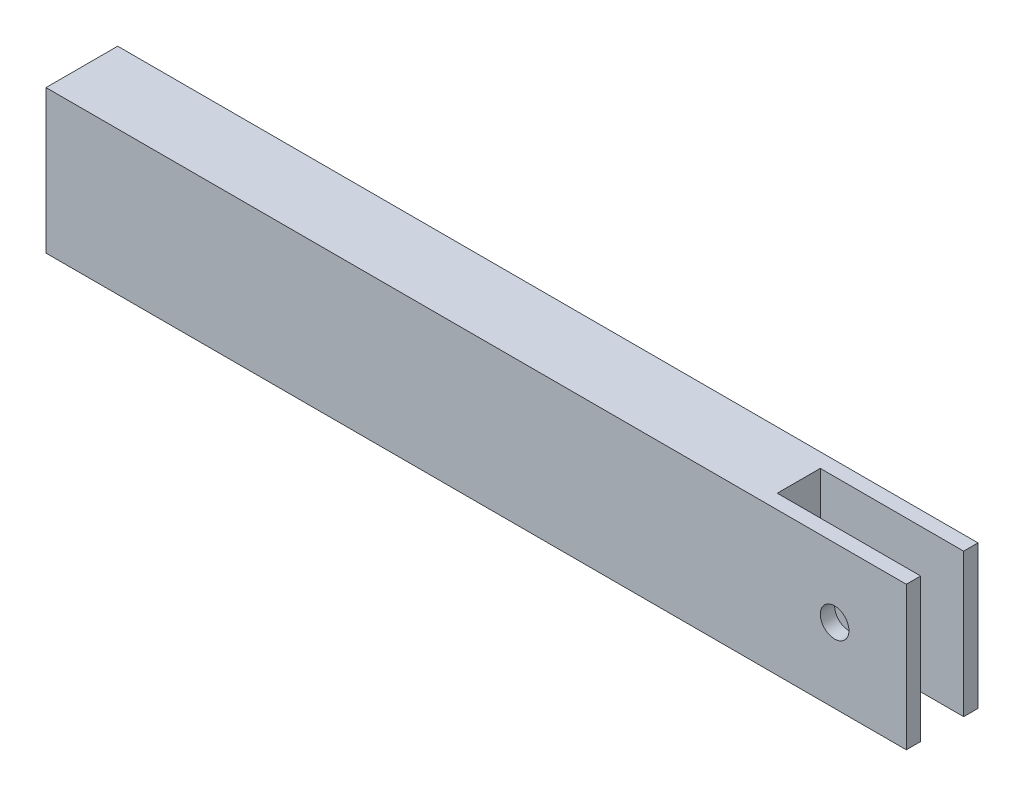
ISO-10303-21;
HEADER;
FILE_DESCRIPTION(('STEP AP214'),'2;1');
FILE_NAME('part.step','',(''),(''),'','','');
FILE_SCHEMA(('AUTOMOTIVE_DESIGN { 1 0 10303 214 1 1 1 1 }'));
ENDSEC;
DATA;
#1=APPLICATION_CONTEXT('core data for automotive mechanical design processes');
#2=APPLICATION_PROTOCOL_DEFINITION('international standard','automotive_design',2000,#1);
#3=PRODUCT_CONTEXT('',#1,'mechanical');
#4=PRODUCT('Part','Part','',(#3));
#5=PRODUCT_RELATED_PRODUCT_CATEGORY('part','',(#4));
#6=PRODUCT_DEFINITION_FORMATION('','',#4);
#7=PRODUCT_DEFINITION_CONTEXT('part definition',#1,'design');
#8=PRODUCT_DEFINITION('design','',#6,#7);
#9=PRODUCT_DEFINITION_SHAPE('','',#8);
#10=(LENGTH_UNIT() NAMED_UNIT(*) SI_UNIT(.MILLI.,.METRE.));
#11=(NAMED_UNIT(*) PLANE_ANGLE_UNIT() SI_UNIT($,.RADIAN.));
#12=(NAMED_UNIT(*) SI_UNIT($,.STERADIAN.) SOLID_ANGLE_UNIT());
#13=UNCERTAINTY_MEASURE_WITH_UNIT(LENGTH_MEASURE(1.E-05),#10,'distance_accuracy_value','');
#14=(GEOMETRIC_REPRESENTATION_CONTEXT(3) GLOBAL_UNCERTAINTY_ASSIGNED_CONTEXT((#13)) GLOBAL_UNIT_ASSIGNED_CONTEXT((#10,
#11,#12)) REPRESENTATION_CONTEXT('',''));
#15=CARTESIAN_POINT('',(0.,0.,0.));
#16=DIRECTION('',(0.,0.,1.));
#17=DIRECTION('',(1.,0.,0.));
#18=AXIS2_PLACEMENT_3D('',#15,#16,#17);
#19=CARTESIAN_POINT('',(600.,0.,50.));
#20=DIRECTION('',(-1.,0.,0.));
#21=DIRECTION('',(0.,-1.,0.));
#22=AXIS2_PLACEMENT_3D('',#19,#20,#21);
#23=PLANE('',#22);
#24=DIRECTION('',(0.,0.,-1.));
#25=VECTOR('',#24,1.);
#26=CARTESIAN_POINT('',(600.,0.,50.));
#27=LINE('',#26,#25);
#28=CARTESIAN_POINT('',(600.,0.,50.));
#29=VERTEX_POINT('',#28);
#30=CARTESIAN_POINT('',(600.,6.66133814775094E-13,40.));
#31=VERTEX_POINT('',#30);
#32=EDGE_CURVE('E45',#29,#31,#27,.T.);
#33=ORIENTED_EDGE('',*,*,#32,.T.);
#34=DIRECTION('',(0.,-1.,0.));
#35=VECTOR('',#34,1.);
#36=CARTESIAN_POINT('',(600.,100.,40.));
#37=LINE('',#36,#35);
#38=CARTESIAN_POINT('',(600.,100.,40.));
#39=VERTEX_POINT('',#38);
#40=EDGE_CURVE('E115',#39,#31,#37,.T.);
#41=ORIENTED_EDGE('',*,*,#40,.F.);
#42=DIRECTION('',(0.,0.,-1.));
#43=VECTOR('',#42,1.);
#44=CARTESIAN_POINT('',(600.,100.,50.));
#45=LINE('',#44,#43);
#46=CARTESIAN_POINT('',(600.,100.,50.));
#47=VERTEX_POINT('',#46);
#48=EDGE_CURVE('E163',#47,#39,#45,.T.);
#49=ORIENTED_EDGE('',*,*,#48,.F.);
#50=DIRECTION('',(0.,1.,0.));
#51=VECTOR('',#50,1.);
#52=CARTESIAN_POINT('',(600.,0.,50.));
#53=LINE('',#52,#51);
#54=EDGE_CURVE('E148',#29,#47,#53,.T.);
#55=ORIENTED_EDGE('',*,*,#54,.F.);
#56=EDGE_LOOP('',(#33,#41,#49,#55));
#57=FACE_BOUND('',#56,.T.);
#58=ADVANCED_FACE('F36',(#57),#23,.F.);
#59=CARTESIAN_POINT('',(0.,0.,50.));
#60=DIRECTION('',(1.,0.,0.));
#61=DIRECTION('',(0.,0.,-1.));
#62=AXIS2_PLACEMENT_3D('',#59,#60,#61);
#63=PLANE('',#62);
#64=DIRECTION('',(0.,-1.,0.));
#65=VECTOR('',#64,1.);
#66=CARTESIAN_POINT('',(0.,0.,0.));
#67=LINE('',#66,#65);
#68=CARTESIAN_POINT('',(0.,100.,0.));
#69=VERTEX_POINT('',#68);
#70=CARTESIAN_POINT('',(0.,0.,0.));
#71=VERTEX_POINT('',#70);
#72=EDGE_CURVE('E140',#69,#71,#67,.T.);
#73=ORIENTED_EDGE('',*,*,#72,.T.);
#74=DIRECTION('',(0.,0.,-1.));
#75=VECTOR('',#74,1.);
#76=CARTESIAN_POINT('',(0.,0.,50.));
#77=LINE('',#76,#75);
#78=CARTESIAN_POINT('',(0.,0.,50.));
#79=VERTEX_POINT('',#78);
#80=EDGE_CURVE('E11',#79,#71,#77,.T.);
#81=ORIENTED_EDGE('',*,*,#80,.F.);
#82=DIRECTION('',(0.,-1.,0.));
#83=VECTOR('',#82,1.);
#84=CARTESIAN_POINT('',(0.,0.,50.));
#85=LINE('',#84,#83);
#86=CARTESIAN_POINT('',(0.,100.,50.));
#87=VERTEX_POINT('',#86);
#88=EDGE_CURVE('E145',#87,#79,#85,.T.);
#89=ORIENTED_EDGE('',*,*,#88,.F.);
#90=DIRECTION('',(0.,0.,-1.));
#91=VECTOR('',#90,1.);
#92=CARTESIAN_POINT('',(0.,100.,50.));
#93=LINE('',#92,#91);
#94=EDGE_CURVE('E151',#87,#69,#93,.T.);
#95=ORIENTED_EDGE('',*,*,#94,.T.);
#96=EDGE_LOOP('',(#73,#81,#89,#95));
#97=FACE_BOUND('',#96,.T.);
#98=ADVANCED_FACE('F38',(#97),#63,.F.);
#99=CARTESIAN_POINT('',(0.,0.,50.));
#100=DIRECTION('',(0.,1.,0.));
#101=DIRECTION('',(0.,0.,1.));
#102=AXIS2_PLACEMENT_3D('',#99,#100,#101);
#103=PLANE('',#102);
#104=DIRECTION('',(0.,0.,-1.));
#105=VECTOR('',#104,1.);
#106=CARTESIAN_POINT('',(500.,5.55111512312578E-13,40.));
#107=LINE('',#106,#105);
#108=CARTESIAN_POINT('',(500.,5.55111512312578E-13,40.));
#109=VERTEX_POINT('',#108);
#110=CARTESIAN_POINT('',(500.,5.55111512312578E-13,9.99999999999999));
#111=VERTEX_POINT('',#110);
#112=EDGE_CURVE('E122',#109,#111,#107,.T.);
#113=ORIENTED_EDGE('',*,*,#112,.F.);
#114=DIRECTION('',(1.,0.,0.));
#115=VECTOR('',#114,1.);
#116=CARTESIAN_POINT('',(500.,5.55111512312578E-13,40.));
#117=LINE('',#116,#115);
#118=EDGE_CURVE('E110',#109,#31,#117,.T.);
#119=ORIENTED_EDGE('',*,*,#118,.T.);
#120=ORIENTED_EDGE('',*,*,#32,.F.);
#121=DIRECTION('',(1.,0.,0.));
#122=VECTOR('',#121,1.);
#123=CARTESIAN_POINT('',(0.,0.,50.));
#124=LINE('',#123,#122);
#125=EDGE_CURVE('E88',#79,#29,#124,.T.);
#126=ORIENTED_EDGE('',*,*,#125,.F.);
#127=ORIENTED_EDGE('',*,*,#80,.T.);
#128=DIRECTION('',(1.,0.,0.));
#129=VECTOR('',#128,1.);
#130=CARTESIAN_POINT('',(0.,0.,0.));
#131=LINE('',#130,#129);
#132=CARTESIAN_POINT('',(600.,0.,0.));
#133=VERTEX_POINT('',#132);
#134=EDGE_CURVE('E154',#71,#133,#131,.T.);
#135=ORIENTED_EDGE('',*,*,#134,.T.);
#136=CARTESIAN_POINT('',(600.,6.66133814775094E-13,9.99999999999999));
#137=VERTEX_POINT('',#136);
#138=EDGE_CURVE('E166',#137,#133,#27,.T.);
#139=ORIENTED_EDGE('',*,*,#138,.F.);
#140=DIRECTION('',(1.,0.,0.));
#141=VECTOR('',#140,1.);
#142=CARTESIAN_POINT('',(500.,5.55111512312578E-13,9.99999999999999));
#143=LINE('',#142,#141);
#144=EDGE_CURVE('E118',#111,#137,#143,.T.);
#145=ORIENTED_EDGE('',*,*,#144,.F.);
#146=EDGE_LOOP('',(#113,#119,#120,#126,#127,#135,#139,#145));
#147=FACE_BOUND('',#146,.T.);
#148=ADVANCED_FACE('F128',(#147),#103,.F.);
#149=CARTESIAN_POINT('',(600.,100.,10.));
#150=VERTEX_POINT('',#149);
#151=CARTESIAN_POINT('',(600.,100.,0.));
#152=VERTEX_POINT('',#151);
#153=EDGE_CURVE('E162',#150,#152,#45,.T.);
#154=ORIENTED_EDGE('',*,*,#153,.F.);
#155=DIRECTION('',(0.,1.,0.));
#156=VECTOR('',#155,1.);
#157=CARTESIAN_POINT('',(600.,100.,10.));
#158=LINE('',#157,#156);
#159=EDGE_CURVE('E126',#137,#150,#158,.T.);
#160=ORIENTED_EDGE('',*,*,#159,.F.);
#161=ORIENTED_EDGE('',*,*,#138,.T.);
#162=DIRECTION('',(0.,1.,0.));
#163=VECTOR('',#162,1.);
#164=CARTESIAN_POINT('',(600.,0.,0.));
#165=LINE('',#164,#163);
#166=EDGE_CURVE('E157',#133,#152,#165,.T.);
#167=ORIENTED_EDGE('',*,*,#166,.T.);
#168=EDGE_LOOP('',(#154,#160,#161,#167));
#169=FACE_BOUND('',#168,.T.);
#170=ADVANCED_FACE('F172',(#169),#23,.F.);
#171=CARTESIAN_POINT('',(0.,100.,50.));
#172=DIRECTION('',(0.,-1.,0.));
#173=DIRECTION('',(0.,0.,-1.));
#174=AXIS2_PLACEMENT_3D('',#171,#172,#173);
#175=PLANE('',#174);
#176=ORIENTED_EDGE('',*,*,#48,.T.);
#177=DIRECTION('',(1.,0.,0.));
#178=VECTOR('',#177,1.);
#179=CARTESIAN_POINT('',(500.,99.9999999999999,40.));
#180=LINE('',#179,#178);
#181=CARTESIAN_POINT('',(500.,99.9999999999999,40.));
#182=VERTEX_POINT('',#181);
#183=EDGE_CURVE('E138',#182,#39,#180,.T.);
#184=ORIENTED_EDGE('',*,*,#183,.F.);
#185=DIRECTION('',(0.,0.,1.));
#186=VECTOR('',#185,1.);
#187=CARTESIAN_POINT('',(500.,99.9999999999999,40.));
#188=LINE('',#187,#186);
#189=CARTESIAN_POINT('',(500.,100.,9.99999999999999));
#190=VERTEX_POINT('',#189);
#191=EDGE_CURVE('E119',#190,#182,#188,.T.);
#192=ORIENTED_EDGE('',*,*,#191,.F.);
#193=DIRECTION('',(1.,0.,0.));
#194=VECTOR('',#193,1.);
#195=CARTESIAN_POINT('',(500.,99.9999999999999,10.));
#196=LINE('',#195,#194);
#197=EDGE_CURVE('E141',#190,#150,#196,.T.);
#198=ORIENTED_EDGE('',*,*,#197,.T.);
#199=ORIENTED_EDGE('',*,*,#153,.T.);
#200=DIRECTION('',(-1.,0.,0.));
#201=VECTOR('',#200,1.);
#202=CARTESIAN_POINT('',(0.,100.,0.));
#203=LINE('',#202,#201);
#204=EDGE_CURVE('E81',#152,#69,#203,.T.);
#205=ORIENTED_EDGE('',*,*,#204,.T.);
#206=ORIENTED_EDGE('',*,*,#94,.F.);
#207=DIRECTION('',(-1.,0.,0.));
#208=VECTOR('',#207,1.);
#209=CARTESIAN_POINT('',(0.,100.,50.));
#210=LINE('',#209,#208);
#211=EDGE_CURVE('E61',#47,#87,#210,.T.);
#212=ORIENTED_EDGE('',*,*,#211,.F.);
#213=EDGE_LOOP('',(#176,#184,#192,#198,#199,#205,#206,#212));
#214=FACE_BOUND('',#213,.T.);
#215=ADVANCED_FACE('F180',(#214),#175,.F.);
#216=CARTESIAN_POINT('',(0.,0.,50.));
#217=DIRECTION('',(0.,0.,-1.));
#218=DIRECTION('',(-1.,0.,0.));
#219=AXIS2_PLACEMENT_3D('',#216,#217,#218);
#220=PLANE('',#219);
#221=CARTESIAN_POINT('',(550.,51.9500232108523,50.));
#222=DIRECTION('',(0.,0.,1.));
#223=DIRECTION('',(1.,0.,0.));
#224=AXIS2_PLACEMENT_3D('',#221,#222,#223);
#225=CIRCLE('',#224,9.99999999999998);
#226=CARTESIAN_POINT('',(560.,51.9500232108523,50.));
#227=VERTEX_POINT('',#226);
#228=EDGE_CURVE('E311',#227,#227,#225,.T.);
#229=ORIENTED_EDGE('',*,*,#228,.F.);
#230=EDGE_LOOP('',(#229));
#231=FACE_BOUND('',#230,.T.);
#232=ORIENTED_EDGE('',*,*,#88,.T.);
#233=ORIENTED_EDGE('',*,*,#125,.T.);
#234=ORIENTED_EDGE('',*,*,#54,.T.);
#235=ORIENTED_EDGE('',*,*,#211,.T.);
#236=EDGE_LOOP('',(#232,#233,#234,#235));
#237=FACE_BOUND('',#236,.T.);
#238=ADVANCED_FACE('F182',(#231,#237),#220,.F.);
#239=CARTESIAN_POINT('',(0.,0.,0.));
#240=DIRECTION('',(0.,0.,-1.));
#241=DIRECTION('',(-1.,0.,0.));
#242=AXIS2_PLACEMENT_3D('',#239,#240,#241);
#243=PLANE('',#242);
#244=CARTESIAN_POINT('',(550.,51.9500232108523,0.));
#245=DIRECTION('',(0.,0.,1.));
#246=DIRECTION('',(1.,0.,0.));
#247=AXIS2_PLACEMENT_3D('',#244,#245,#246);
#248=CIRCLE('',#247,9.99999999999998);
#249=CARTESIAN_POINT('',(560.,51.9500232108523,0.));
#250=VERTEX_POINT('',#249);
#251=EDGE_CURVE('E315',#250,#250,#248,.T.);
#252=ORIENTED_EDGE('',*,*,#251,.T.);
#253=EDGE_LOOP('',(#252));
#254=FACE_BOUND('',#253,.T.);
#255=ORIENTED_EDGE('',*,*,#72,.F.);
#256=ORIENTED_EDGE('',*,*,#204,.F.);
#257=ORIENTED_EDGE('',*,*,#166,.F.);
#258=ORIENTED_EDGE('',*,*,#134,.F.);
#259=EDGE_LOOP('',(#255,#256,#257,#258));
#260=FACE_BOUND('',#259,.T.);
#261=ADVANCED_FACE('F177',(#254,#260),#243,.T.);
#262=CARTESIAN_POINT('',(500.,99.9999999999999,40.));
#263=DIRECTION('',(0.,0.,1.));
#264=DIRECTION('',(0.,-1.,0.));
#265=AXIS2_PLACEMENT_3D('',#262,#263,#264);
#266=PLANE('',#265);
#267=CARTESIAN_POINT('',(550.,51.9500232108523,40.));
#268=DIRECTION('',(0.,0.,1.));
#269=DIRECTION('',(0.,-1.,0.));
#270=AXIS2_PLACEMENT_3D('',#267,#268,#269);
#271=CIRCLE('',#270,9.99999999999998);
#272=CARTESIAN_POINT('',(560.,51.9500232108523,40.));
#273=VERTEX_POINT('',#272);
#274=EDGE_CURVE('E136',#273,#273,#271,.T.);
#275=ORIENTED_EDGE('',*,*,#274,.T.);
#276=EDGE_LOOP('',(#275));
#277=FACE_BOUND('',#276,.T.);
#278=ORIENTED_EDGE('',*,*,#40,.T.);
#279=ORIENTED_EDGE('',*,*,#118,.F.);
#280=DIRECTION('',(0.,-1.,0.));
#281=VECTOR('',#280,1.);
#282=CARTESIAN_POINT('',(500.,99.9999999999999,40.));
#283=LINE('',#282,#281);
#284=EDGE_CURVE('E113',#182,#109,#283,.T.);
#285=ORIENTED_EDGE('',*,*,#284,.F.);
#286=ORIENTED_EDGE('',*,*,#183,.T.);
#287=EDGE_LOOP('',(#278,#279,#285,#286));
#288=FACE_BOUND('',#287,.T.);
#289=ADVANCED_FACE('F112',(#277,#288),#266,.F.);
#290=CARTESIAN_POINT('',(500.,99.9999999999999,10.));
#291=DIRECTION('',(0.,0.,-1.));
#292=DIRECTION('',(0.,1.,0.));
#293=AXIS2_PLACEMENT_3D('',#290,#291,#292);
#294=PLANE('',#293);
#295=CARTESIAN_POINT('',(550.,51.9500232108523,9.99999999999999));
#296=DIRECTION('',(0.,0.,-1.));
#297=DIRECTION('',(0.,1.,0.));
#298=AXIS2_PLACEMENT_3D('',#295,#296,#297);
#299=CIRCLE('',#298,9.99999999999998);
#300=CARTESIAN_POINT('',(560.,51.9500232108523,9.99999999999999));
#301=VERTEX_POINT('',#300);
#302=EDGE_CURVE('E40',#301,#301,#299,.T.);
#303=ORIENTED_EDGE('',*,*,#302,.T.);
#304=EDGE_LOOP('',(#303));
#305=FACE_BOUND('',#304,.T.);
#306=ORIENTED_EDGE('',*,*,#159,.T.);
#307=ORIENTED_EDGE('',*,*,#197,.F.);
#308=DIRECTION('',(0.,1.,0.));
#309=VECTOR('',#308,1.);
#310=CARTESIAN_POINT('',(500.,99.9999999999999,10.));
#311=LINE('',#310,#309);
#312=EDGE_CURVE('E52',#111,#190,#311,.T.);
#313=ORIENTED_EDGE('',*,*,#312,.F.);
#314=ORIENTED_EDGE('',*,*,#144,.T.);
#315=EDGE_LOOP('',(#306,#307,#313,#314));
#316=FACE_BOUND('',#315,.T.);
#317=ADVANCED_FACE('F230',(#305,#316),#294,.F.);
#318=CARTESIAN_POINT('',(500.,5.55111512312583E-13,0.));
#319=DIRECTION('',(1.,0.,0.));
#320=DIRECTION('',(0.,1.,0.));
#321=AXIS2_PLACEMENT_3D('',#318,#319,#320);
#322=PLANE('',#321);
#323=ORIENTED_EDGE('',*,*,#284,.T.);
#324=ORIENTED_EDGE('',*,*,#112,.T.);
#325=ORIENTED_EDGE('',*,*,#312,.T.);
#326=ORIENTED_EDGE('',*,*,#191,.T.);
#327=EDGE_LOOP('',(#323,#324,#325,#326));
#328=FACE_BOUND('',#327,.T.);
#329=ADVANCED_FACE('F121',(#328),#322,.T.);
#330=CARTESIAN_POINT('',(550.,51.9500232108523,0.));
#331=DIRECTION('',(0.,0.,1.));
#332=DIRECTION('',(1.,0.,0.));
#333=AXIS2_PLACEMENT_3D('',#330,#331,#332);
#334=CYLINDRICAL_SURFACE('',#333,9.99999999999998);
#335=CARTESIAN_POINT('',(560.,51.9500232108523,0.));
#336=CARTESIAN_POINT('',(560.,51.9500232108523,0.104166666666667));
#337=CARTESIAN_POINT('',(560.,51.9500232108523,0.208333333333333));
#338=CARTESIAN_POINT('',(560.,51.9500232108523,0.416666666666666));
#339=CARTESIAN_POINT('',(560.,51.9500232108523,0.520833333333333));
#340=CARTESIAN_POINT('',(560.,51.9500232108523,0.729166666666666));
#341=CARTESIAN_POINT('',(560.,51.9500232108523,0.833333333333333));
#342=CARTESIAN_POINT('',(560.,51.9500232108523,1.04166666666667));
#343=CARTESIAN_POINT('',(560.,51.9500232108523,1.14583333333333));
#344=CARTESIAN_POINT('',(560.,51.9500232108523,1.35416666666667));
#345=CARTESIAN_POINT('',(560.,51.9500232108523,1.45833333333333));
#346=CARTESIAN_POINT('',(560.,51.9500232108523,1.66666666666667));
#347=CARTESIAN_POINT('',(560.,51.9500232108523,1.77083333333333));
#348=CARTESIAN_POINT('',(560.,51.9500232108523,1.97916666666667));
#349=CARTESIAN_POINT('',(560.,51.9500232108523,2.08333333333333));
#350=CARTESIAN_POINT('',(560.,51.9500232108523,2.29166666666666));
#351=CARTESIAN_POINT('',(560.,51.9500232108523,2.39583333333333));
#352=CARTESIAN_POINT('',(560.,51.9500232108523,2.60416666666666));
#353=CARTESIAN_POINT('',(560.,51.9500232108523,2.70833333333333));
#354=CARTESIAN_POINT('',(560.,51.9500232108523,2.91666666666666));
#355=CARTESIAN_POINT('',(560.,51.9500232108523,3.02083333333333));
#356=CARTESIAN_POINT('',(560.,51.9500232108523,3.22916666666666));
#357=CARTESIAN_POINT('',(560.,51.9500232108523,3.33333333333333));
#358=CARTESIAN_POINT('',(560.,51.9500232108523,3.54166666666666));
#359=CARTESIAN_POINT('',(560.,51.9500232108523,3.64583333333333));
#360=CARTESIAN_POINT('',(560.,51.9500232108523,3.85416666666666));
#361=CARTESIAN_POINT('',(560.,51.9500232108523,3.95833333333333));
#362=CARTESIAN_POINT('',(560.,51.9500232108523,4.16666666666666));
#363=CARTESIAN_POINT('',(560.,51.9500232108523,4.27083333333333));
#364=CARTESIAN_POINT('',(560.,51.9500232108523,4.47916666666666));
#365=CARTESIAN_POINT('',(560.,51.9500232108523,4.58333333333333));
#366=CARTESIAN_POINT('',(560.,51.9500232108523,4.79166666666666));
#367=CARTESIAN_POINT('',(560.,51.9500232108523,4.89583333333333));
#368=CARTESIAN_POINT('',(560.,51.9500232108523,5.10416666666666));
#369=CARTESIAN_POINT('',(560.,51.9500232108523,5.20833333333333));
#370=CARTESIAN_POINT('',(560.,51.9500232108523,5.41666666666666));
#371=CARTESIAN_POINT('',(560.,51.9500232108523,5.52083333333333));
#372=CARTESIAN_POINT('',(560.,51.9500232108523,5.72916666666666));
#373=CARTESIAN_POINT('',(560.,51.9500232108523,5.83333333333333));
#374=CARTESIAN_POINT('',(560.,51.9500232108523,6.04166666666666));
#375=CARTESIAN_POINT('',(560.,51.9500232108523,6.14583333333333));
#376=CARTESIAN_POINT('',(560.,51.9500232108523,6.35416666666666));
#377=CARTESIAN_POINT('',(560.,51.9500232108523,6.45833333333333));
#378=CARTESIAN_POINT('',(560.,51.9500232108523,6.66666666666666));
#379=CARTESIAN_POINT('',(560.,51.9500232108523,6.77083333333333));
#380=CARTESIAN_POINT('',(560.,51.9500232108523,6.97916666666666));
#381=CARTESIAN_POINT('',(560.,51.9500232108523,7.08333333333333));
#382=CARTESIAN_POINT('',(560.,51.9500232108523,7.29166666666666));
#383=CARTESIAN_POINT('',(560.,51.9500232108523,7.39583333333333));
#384=CARTESIAN_POINT('',(560.,51.9500232108523,7.60416666666666));
#385=CARTESIAN_POINT('',(560.,51.9500232108523,7.70833333333333));
#386=CARTESIAN_POINT('',(560.,51.9500232108523,7.91666666666666));
#387=CARTESIAN_POINT('',(560.,51.9500232108523,8.02083333333333));
#388=CARTESIAN_POINT('',(560.,51.9500232108523,8.22916666666666));
#389=CARTESIAN_POINT('',(560.,51.9500232108523,8.33333333333333));
#390=CARTESIAN_POINT('',(560.,51.9500232108523,8.54166666666666));
#391=CARTESIAN_POINT('',(560.,51.9500232108523,8.64583333333333));
#392=CARTESIAN_POINT('',(560.,51.9500232108523,8.85416666666666));
#393=CARTESIAN_POINT('',(560.,51.9500232108523,8.95833333333333));
#394=CARTESIAN_POINT('',(560.,51.9500232108523,9.16666666666666));
#395=CARTESIAN_POINT('',(560.,51.9500232108523,9.27083333333333));
#396=CARTESIAN_POINT('',(560.,51.9500232108523,9.47916666666666));
#397=CARTESIAN_POINT('',(560.,51.9500232108523,9.58333333333333));
#398=CARTESIAN_POINT('',(560.,51.9500232108523,9.79166666666666));
#399=CARTESIAN_POINT('',(560.,51.9500232108523,9.89583333333333));
#400=CARTESIAN_POINT('',(560.,51.9500232108523,9.99999999999999));
#401=B_SPLINE_CURVE_WITH_KNOTS('',3,(#335,#336,#337,#338,#339,#340,#341,#342,#343,#344,#345,
#346,#347,#348,#349,#350,#351,#352,#353,#354,#355,#356,#357,#358,#359,#360,#361,#362,#363,#364,
#365,#366,#367,#368,#369,#370,#371,#372,#373,#374,#375,#376,#377,#378,#379,#380,#381,#382,#383,
#384,#385,#386,#387,#388,#389,#390,#391,#392,#393,#394,#395,#396,#397,#398,#399,#400),
.UNSPECIFIED.,.F.,.F.,(4,2,2,2,2,2,2,2,2,2,2,2,2,2,2,2,2,2,2,2,2,2,2,2,2,2,2,2,2,2,2,2,4),(0.,
0.3125,0.625,0.937499999999999,1.25,1.5625,1.875,2.1875,2.5,2.8125,3.125,3.4375,3.75,4.0625,
4.375,4.6875,5.,5.3125,5.625,5.9375,6.25,6.5625,6.875,7.18749999999999,7.5,7.8125,
8.12499999999999,8.43749999999999,8.74999999999999,9.06249999999999,9.37499999999999,
9.68749999999999,9.99999999999999),.UNSPECIFIED.);
#402=EDGE_CURVE('BSEAM248',#250,#301,#401,.T.);
#403=ORIENTED_EDGE('',*,*,#251,.F.);
#404=ORIENTED_EDGE('',*,*,#302,.F.);
#405=ORIENTED_EDGE('',*,*,#402,.T.);
#406=ORIENTED_EDGE('',*,*,#402,.F.);
#407=EDGE_LOOP('',(#403,#405,#404,#406));
#408=FACE_BOUND('',#407,.T.);
#409=ADVANCED_FACE('F248',(#408),#334,.F.);
#410=CARTESIAN_POINT('',(560.,51.9500232108523,50.));
#411=CARTESIAN_POINT('',(560.,51.9500232108523,49.8958333333333));
#412=CARTESIAN_POINT('',(560.,51.9500232108523,49.7916666666667));
#413=CARTESIAN_POINT('',(560.,51.9500232108523,49.5833333333333));
#414=CARTESIAN_POINT('',(560.,51.9500232108523,49.4791666666667));
#415=CARTESIAN_POINT('',(560.,51.9500232108523,49.2708333333333));
#416=CARTESIAN_POINT('',(560.,51.9500232108523,49.1666666666667));
#417=CARTESIAN_POINT('',(560.,51.9500232108523,48.9583333333333));
#418=CARTESIAN_POINT('',(560.,51.9500232108523,48.8541666666667));
#419=CARTESIAN_POINT('',(560.,51.9500232108523,48.6458333333333));
#420=CARTESIAN_POINT('',(560.,51.9500232108523,48.5416666666667));
#421=CARTESIAN_POINT('',(560.,51.9500232108523,48.3333333333333));
#422=CARTESIAN_POINT('',(560.,51.9500232108523,48.2291666666667));
#423=CARTESIAN_POINT('',(560.,51.9500232108523,48.0208333333333));
#424=CARTESIAN_POINT('',(560.,51.9500232108523,47.9166666666667));
#425=CARTESIAN_POINT('',(560.,51.9500232108523,47.7083333333333));
#426=CARTESIAN_POINT('',(560.,51.9500232108523,47.6041666666667));
#427=CARTESIAN_POINT('',(560.,51.9500232108523,47.3958333333333));
#428=CARTESIAN_POINT('',(560.,51.9500232108523,47.2916666666667));
#429=CARTESIAN_POINT('',(560.,51.9500232108523,47.0833333333333));
#430=CARTESIAN_POINT('',(560.,51.9500232108523,46.9791666666667));
#431=CARTESIAN_POINT('',(560.,51.9500232108523,46.7708333333333));
#432=CARTESIAN_POINT('',(560.,51.9500232108523,46.6666666666667));
#433=CARTESIAN_POINT('',(560.,51.9500232108523,46.4583333333333));
#434=CARTESIAN_POINT('',(560.,51.9500232108523,46.3541666666667));
#435=CARTESIAN_POINT('',(560.,51.9500232108523,46.1458333333333));
#436=CARTESIAN_POINT('',(560.,51.9500232108523,46.0416666666667));
#437=CARTESIAN_POINT('',(560.,51.9500232108523,45.8333333333333));
#438=CARTESIAN_POINT('',(560.,51.9500232108523,45.7291666666667));
#439=CARTESIAN_POINT('',(560.,51.9500232108523,45.5208333333333));
#440=CARTESIAN_POINT('',(560.,51.9500232108523,45.4166666666667));
#441=CARTESIAN_POINT('',(560.,51.9500232108523,45.2083333333333));
#442=CARTESIAN_POINT('',(560.,51.9500232108523,45.1041666666667));
#443=CARTESIAN_POINT('',(560.,51.9500232108523,44.8958333333333));
#444=CARTESIAN_POINT('',(560.,51.9500232108523,44.7916666666667));
#445=CARTESIAN_POINT('',(560.,51.9500232108523,44.5833333333333));
#446=CARTESIAN_POINT('',(560.,51.9500232108523,44.4791666666667));
#447=CARTESIAN_POINT('',(560.,51.9500232108523,44.2708333333333));
#448=CARTESIAN_POINT('',(560.,51.9500232108523,44.1666666666667));
#449=CARTESIAN_POINT('',(560.,51.9500232108523,43.9583333333333));
#450=CARTESIAN_POINT('',(560.,51.9500232108523,43.8541666666667));
#451=CARTESIAN_POINT('',(560.,51.9500232108523,43.6458333333333));
#452=CARTESIAN_POINT('',(560.,51.9500232108523,43.5416666666667));
#453=CARTESIAN_POINT('',(560.,51.9500232108523,43.3333333333333));
#454=CARTESIAN_POINT('',(560.,51.9500232108523,43.2291666666667));
#455=CARTESIAN_POINT('',(560.,51.9500232108523,43.0208333333333));
#456=CARTESIAN_POINT('',(560.,51.9500232108523,42.9166666666667));
#457=CARTESIAN_POINT('',(560.,51.9500232108523,42.7083333333333));
#458=CARTESIAN_POINT('',(560.,51.9500232108523,42.6041666666667));
#459=CARTESIAN_POINT('',(560.,51.9500232108523,42.3958333333333));
#460=CARTESIAN_POINT('',(560.,51.9500232108523,42.2916666666667));
#461=CARTESIAN_POINT('',(560.,51.9500232108523,42.0833333333333));
#462=CARTESIAN_POINT('',(560.,51.9500232108523,41.9791666666667));
#463=CARTESIAN_POINT('',(560.,51.9500232108523,41.7708333333333));
#464=CARTESIAN_POINT('',(560.,51.9500232108523,41.6666666666667));
#465=CARTESIAN_POINT('',(560.,51.9500232108523,41.4583333333333));
#466=CARTESIAN_POINT('',(560.,51.9500232108523,41.3541666666667));
#467=CARTESIAN_POINT('',(560.,51.9500232108523,41.1458333333333));
#468=CARTESIAN_POINT('',(560.,51.9500232108523,41.0416666666667));
#469=CARTESIAN_POINT('',(560.,51.9500232108523,40.8333333333333));
#470=CARTESIAN_POINT('',(560.,51.9500232108523,40.7291666666667));
#471=CARTESIAN_POINT('',(560.,51.9500232108523,40.5208333333333));
#472=CARTESIAN_POINT('',(560.,51.9500232108523,40.4166666666667));
#473=CARTESIAN_POINT('',(560.,51.9500232108523,40.2083333333333));
#474=CARTESIAN_POINT('',(560.,51.9500232108523,40.1041666666667));
#475=CARTESIAN_POINT('',(560.,51.9500232108523,40.));
#476=B_SPLINE_CURVE_WITH_KNOTS('',3,(#410,#411,#412,#413,#414,#415,#416,#417,#418,#419,#420,
#421,#422,#423,#424,#425,#426,#427,#428,#429,#430,#431,#432,#433,#434,#435,#436,#437,#438,#439,
#440,#441,#442,#443,#444,#445,#446,#447,#448,#449,#450,#451,#452,#453,#454,#455,#456,#457,#458,
#459,#460,#461,#462,#463,#464,#465,#466,#467,#468,#469,#470,#471,#472,#473,#474,#475),
.UNSPECIFIED.,.F.,.F.,(4,2,2,2,2,2,2,2,2,2,2,2,2,2,2,2,2,2,2,2,2,2,2,2,2,2,2,2,2,2,2,2,4),(0.,
0.3125,0.625000000000001,0.937500000000001,1.25,1.5625,1.875,2.1875,2.5,2.8125,3.125,3.4375,
3.75,4.0625,4.375,4.6875,5.,5.3125,5.62500000000001,5.93750000000001,6.25000000000001,
6.56250000000001,6.87500000000001,7.18750000000001,7.50000000000001,7.81250000000001,
8.12500000000001,8.43750000000001,8.75000000000001,9.06250000000001,9.37500000000001,
9.68750000000001,10.),.UNSPECIFIED.);
#477=EDGE_CURVE('BSEAM257',#227,#273,#476,.T.);
#478=ORIENTED_EDGE('',*,*,#228,.T.);
#479=ORIENTED_EDGE('',*,*,#274,.F.);
#480=ORIENTED_EDGE('',*,*,#477,.T.);
#481=ORIENTED_EDGE('',*,*,#477,.F.);
#482=EDGE_LOOP('',(#478,#480,#479,#481));
#483=FACE_BOUND('',#482,.T.);
#484=ADVANCED_FACE('F257',(#483),#334,.F.);
#485=CLOSED_SHELL('',(#58,#98,#148,#170,#215,#238,#261,#289,#317,#329,#409,#484));
#486=MANIFOLD_SOLID_BREP('B2',#485);
#487=ADVANCED_BREP_SHAPE_REPRESENTATION('',(#18,#486),#14);
#488=SHAPE_DEFINITION_REPRESENTATION(#9,#487);
ENDSEC;
END-ISO-10303-21;
